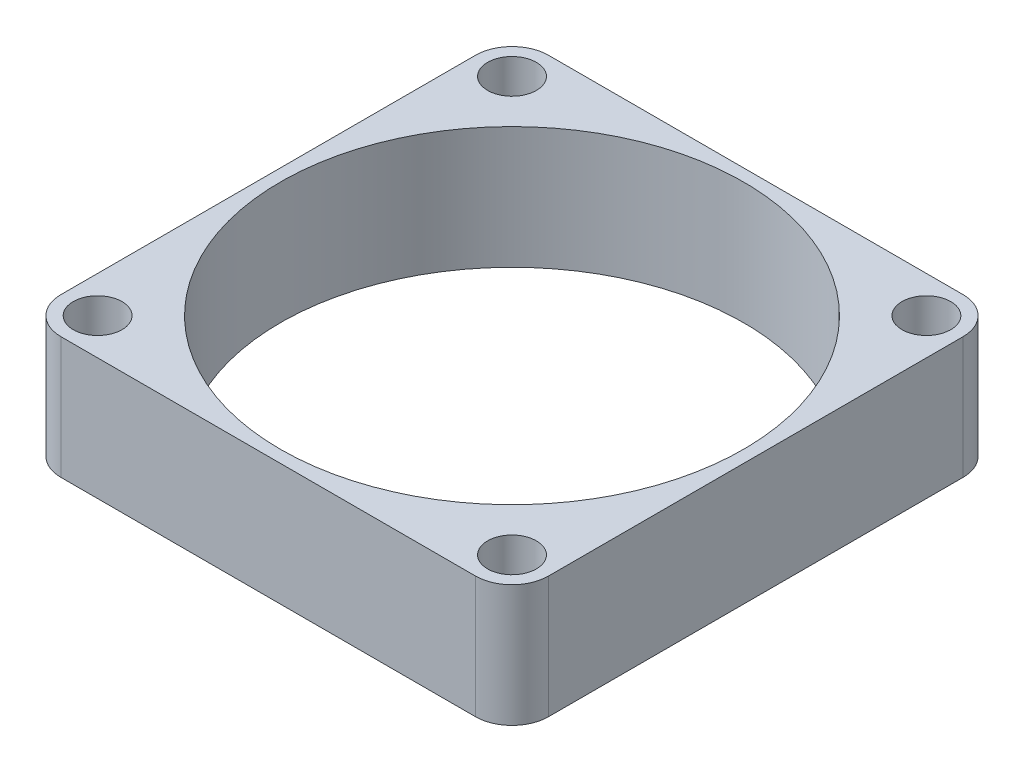
ISO-10303-21;
HEADER;
FILE_DESCRIPTION(('STEP AP214'),'2;1');
FILE_NAME('part.step','',(''),(''),'','','');
FILE_SCHEMA(('AUTOMOTIVE_DESIGN { 1 0 10303 214 1 1 1 1 }'));
ENDSEC;
DATA;
#1=APPLICATION_CONTEXT('core data for automotive mechanical design processes');
#2=APPLICATION_PROTOCOL_DEFINITION('international standard','automotive_design',2000,#1);
#3=PRODUCT_CONTEXT('',#1,'mechanical');
#4=PRODUCT('Part','Part','',(#3));
#5=PRODUCT_RELATED_PRODUCT_CATEGORY('part','',(#4));
#6=PRODUCT_DEFINITION_FORMATION('','',#4);
#7=PRODUCT_DEFINITION_CONTEXT('part definition',#1,'design');
#8=PRODUCT_DEFINITION('design','',#6,#7);
#9=PRODUCT_DEFINITION_SHAPE('','',#8);
#10=(LENGTH_UNIT() NAMED_UNIT(*) SI_UNIT(.MILLI.,.METRE.));
#11=(NAMED_UNIT(*) PLANE_ANGLE_UNIT() SI_UNIT($,.RADIAN.));
#12=(NAMED_UNIT(*) SI_UNIT($,.STERADIAN.) SOLID_ANGLE_UNIT());
#13=UNCERTAINTY_MEASURE_WITH_UNIT(LENGTH_MEASURE(1.E-05),#10,'distance_accuracy_value','');
#14=(GEOMETRIC_REPRESENTATION_CONTEXT(3) GLOBAL_UNCERTAINTY_ASSIGNED_CONTEXT((#13)) GLOBAL_UNIT_ASSIGNED_CONTEXT((#10,
#11,#12)) REPRESENTATION_CONTEXT('',''));
#15=CARTESIAN_POINT('',(0.,0.,0.));
#16=DIRECTION('',(0.,0.,1.));
#17=DIRECTION('',(1.,0.,0.));
#18=AXIS2_PLACEMENT_3D('',#15,#16,#17);
#19=CARTESIAN_POINT('',(37.,10.,-37.));
#20=DIRECTION('',(0.,-1.,0.));
#21=DIRECTION('',(0.,0.,-1.));
#22=AXIS2_PLACEMENT_3D('',#19,#20,#21);
#23=PLANE('',#22);
#24=CARTESIAN_POINT('',(37.,10.,-37.));
#25=DIRECTION('',(0.,1.,0.));
#26=DIRECTION('',(0.,0.,-1.));
#27=AXIS2_PLACEMENT_3D('',#24,#25,#26);
#28=CIRCLE('',#27,3.);
#29=CARTESIAN_POINT('',(40.,10.,-37.));
#30=VERTEX_POINT('',#29);
#31=CARTESIAN_POINT('',(37.,10.,-40.));
#32=VERTEX_POINT('',#31);
#33=EDGE_CURVE('E146',#30,#32,#28,.T.);
#34=ORIENTED_EDGE('',*,*,#33,.T.);
#35=DIRECTION('',(-1.,0.,0.));
#36=VECTOR('',#35,1.);
#37=CARTESIAN_POINT('',(3.00000000000002,10.,-40.));
#38=LINE('',#37,#36);
#39=CARTESIAN_POINT('',(3.00000000000002,10.,-40.));
#40=VERTEX_POINT('',#39);
#41=EDGE_CURVE('E94',#32,#40,#38,.T.);
#42=ORIENTED_EDGE('',*,*,#41,.T.);
#43=CARTESIAN_POINT('',(3.,10.,-37.));
#44=DIRECTION('',(0.,1.,0.));
#45=DIRECTION('',(0.,0.,-1.));
#46=AXIS2_PLACEMENT_3D('',#43,#44,#45);
#47=CIRCLE('',#46,3.);
#48=CARTESIAN_POINT('',(0.,10.,-37.));
#49=VERTEX_POINT('',#48);
#50=EDGE_CURVE('E161',#40,#49,#47,.T.);
#51=ORIENTED_EDGE('',*,*,#50,.T.);
#52=DIRECTION('',(0.,0.,1.));
#53=VECTOR('',#52,1.);
#54=CARTESIAN_POINT('',(0.,10.,-3.00000000000002));
#55=LINE('',#54,#53);
#56=CARTESIAN_POINT('',(0.,10.,-3.00000000000002));
#57=VERTEX_POINT('',#56);
#58=EDGE_CURVE('E174',#49,#57,#55,.T.);
#59=ORIENTED_EDGE('',*,*,#58,.T.);
#60=CARTESIAN_POINT('',(3.,10.,-3.));
#61=DIRECTION('',(0.,1.,0.));
#62=DIRECTION('',(0.,0.,1.));
#63=AXIS2_PLACEMENT_3D('',#60,#61,#62);
#64=CIRCLE('',#63,3.);
#65=CARTESIAN_POINT('',(3.,10.,0.));
#66=VERTEX_POINT('',#65);
#67=EDGE_CURVE('E113',#57,#66,#64,.T.);
#68=ORIENTED_EDGE('',*,*,#67,.T.);
#69=DIRECTION('',(1.,0.,0.));
#70=VECTOR('',#69,1.);
#71=CARTESIAN_POINT('',(3.00000000000002,10.,0.));
#72=LINE('',#71,#70);
#73=CARTESIAN_POINT('',(37.,10.,0.));
#74=VERTEX_POINT('',#73);
#75=EDGE_CURVE('E107',#66,#74,#72,.T.);
#76=ORIENTED_EDGE('',*,*,#75,.T.);
#77=CARTESIAN_POINT('',(37.,10.,-3.));
#78=DIRECTION('',(0.,1.,0.));
#79=DIRECTION('',(0.,0.,-1.));
#80=AXIS2_PLACEMENT_3D('',#77,#78,#79);
#81=CIRCLE('',#80,3.);
#82=CARTESIAN_POINT('',(40.,10.,-3.00000000000002));
#83=VERTEX_POINT('',#82);
#84=EDGE_CURVE('E111',#74,#83,#81,.T.);
#85=ORIENTED_EDGE('',*,*,#84,.T.);
#86=DIRECTION('',(0.,0.,-1.));
#87=VECTOR('',#86,1.);
#88=CARTESIAN_POINT('',(40.,10.,-3.00000000000002));
#89=LINE('',#88,#87);
#90=EDGE_CURVE('E51',#83,#30,#89,.T.);
#91=ORIENTED_EDGE('',*,*,#90,.T.);
#92=EDGE_LOOP('',(#34,#42,#51,#59,#68,#76,#85,#91));
#93=FACE_BOUND('',#92,.T.);
#94=CARTESIAN_POINT('',(20.,10.,-20.));
#95=DIRECTION('',(0.,1.,0.));
#96=DIRECTION('',(0.,0.,1.));
#97=AXIS2_PLACEMENT_3D('',#94,#95,#96);
#98=CIRCLE('',#97,19.);
#99=CARTESIAN_POINT('',(20.,10.,-0.999999999999997));
#100=VERTEX_POINT('',#99);
#101=EDGE_CURVE('E135',#100,#100,#98,.T.);
#102=ORIENTED_EDGE('',*,*,#101,.F.);
#103=EDGE_LOOP('',(#102));
#104=FACE_BOUND('',#103,.T.);
#105=CARTESIAN_POINT('',(3.,10.,-37.));
#106=DIRECTION('',(0.,1.,0.));
#107=DIRECTION('',(0.,0.,1.));
#108=AXIS2_PLACEMENT_3D('',#105,#106,#107);
#109=CIRCLE('',#108,2.);
#110=CARTESIAN_POINT('',(3.,10.,-35.));
#111=VERTEX_POINT('',#110);
#112=EDGE_CURVE('E183',#111,#111,#109,.T.);
#113=ORIENTED_EDGE('',*,*,#112,.F.);
#114=EDGE_LOOP('',(#113));
#115=FACE_BOUND('',#114,.T.);
#116=CARTESIAN_POINT('',(37.,10.,-37.));
#117=DIRECTION('',(0.,1.,0.));
#118=DIRECTION('',(0.,0.,-1.));
#119=AXIS2_PLACEMENT_3D('',#116,#117,#118);
#120=CIRCLE('',#119,2.);
#121=CARTESIAN_POINT('',(37.,10.,-39.));
#122=VERTEX_POINT('',#121);
#123=EDGE_CURVE('E189',#122,#122,#120,.T.);
#124=ORIENTED_EDGE('',*,*,#123,.F.);
#125=EDGE_LOOP('',(#124));
#126=FACE_BOUND('',#125,.T.);
#127=CARTESIAN_POINT('',(37.,10.,-3.));
#128=DIRECTION('',(0.,1.,0.));
#129=DIRECTION('',(0.,0.,1.));
#130=AXIS2_PLACEMENT_3D('',#127,#128,#129);
#131=CIRCLE('',#130,2.);
#132=CARTESIAN_POINT('',(37.,10.,-0.999999999999995));
#133=VERTEX_POINT('',#132);
#134=EDGE_CURVE('E195',#133,#133,#131,.T.);
#135=ORIENTED_EDGE('',*,*,#134,.F.);
#136=EDGE_LOOP('',(#135));
#137=FACE_BOUND('',#136,.T.);
#138=CARTESIAN_POINT('',(3.,10.,-3.));
#139=DIRECTION('',(0.,1.,0.));
#140=DIRECTION('',(0.,0.,-1.));
#141=AXIS2_PLACEMENT_3D('',#138,#139,#140);
#142=CIRCLE('',#141,2.);
#143=CARTESIAN_POINT('',(3.,10.,-5.));
#144=VERTEX_POINT('',#143);
#145=EDGE_CURVE('E201',#144,#144,#142,.T.);
#146=ORIENTED_EDGE('',*,*,#145,.F.);
#147=EDGE_LOOP('',(#146));
#148=FACE_BOUND('',#147,.T.);
#149=ADVANCED_FACE('F34',(#93,#104,#115,#126,#137,#148),#23,.F.);
#150=CARTESIAN_POINT('',(37.,0.,-37.));
#151=DIRECTION('',(0.,-1.,0.));
#152=DIRECTION('',(0.,0.,-1.));
#153=AXIS2_PLACEMENT_3D('',#150,#151,#152);
#154=PLANE('',#153);
#155=CARTESIAN_POINT('',(37.,0.,-3.));
#156=DIRECTION('',(0.,1.,0.));
#157=DIRECTION('',(0.,0.,1.));
#158=AXIS2_PLACEMENT_3D('',#155,#156,#157);
#159=CIRCLE('',#158,2.);
#160=CARTESIAN_POINT('',(37.,0.,-0.999999999999995));
#161=VERTEX_POINT('',#160);
#162=EDGE_CURVE('E198',#161,#161,#159,.T.);
#163=ORIENTED_EDGE('',*,*,#162,.T.);
#164=EDGE_LOOP('',(#163));
#165=FACE_BOUND('',#164,.T.);
#166=CARTESIAN_POINT('',(3.,0.,-37.));
#167=DIRECTION('',(0.,1.,0.));
#168=DIRECTION('',(0.,0.,1.));
#169=AXIS2_PLACEMENT_3D('',#166,#167,#168);
#170=CIRCLE('',#169,2.);
#171=CARTESIAN_POINT('',(3.,0.,-35.));
#172=VERTEX_POINT('',#171);
#173=EDGE_CURVE('E186',#172,#172,#170,.T.);
#174=ORIENTED_EDGE('',*,*,#173,.T.);
#175=EDGE_LOOP('',(#174));
#176=FACE_BOUND('',#175,.T.);
#177=CARTESIAN_POINT('',(37.,0.,-37.));
#178=DIRECTION('',(0.,1.,0.));
#179=DIRECTION('',(0.,0.,-1.));
#180=AXIS2_PLACEMENT_3D('',#177,#178,#179);
#181=CIRCLE('',#180,3.);
#182=CARTESIAN_POINT('',(40.,0.,-37.));
#183=VERTEX_POINT('',#182);
#184=CARTESIAN_POINT('',(37.,0.,-40.));
#185=VERTEX_POINT('',#184);
#186=EDGE_CURVE('E131',#183,#185,#181,.T.);
#187=ORIENTED_EDGE('',*,*,#186,.F.);
#188=DIRECTION('',(0.,0.,-1.));
#189=VECTOR('',#188,1.);
#190=CARTESIAN_POINT('',(40.,0.,-3.00000000000002));
#191=LINE('',#190,#189);
#192=CARTESIAN_POINT('',(40.,0.,-3.00000000000002));
#193=VERTEX_POINT('',#192);
#194=EDGE_CURVE('E86',#193,#183,#191,.T.);
#195=ORIENTED_EDGE('',*,*,#194,.F.);
#196=CARTESIAN_POINT('',(37.,0.,-3.));
#197=DIRECTION('',(0.,1.,0.));
#198=DIRECTION('',(0.,0.,-1.));
#199=AXIS2_PLACEMENT_3D('',#196,#197,#198);
#200=CIRCLE('',#199,3.);
#201=CARTESIAN_POINT('',(37.,0.,0.));
#202=VERTEX_POINT('',#201);
#203=EDGE_CURVE('E80',#202,#193,#200,.T.);
#204=ORIENTED_EDGE('',*,*,#203,.F.);
#205=DIRECTION('',(1.,0.,0.));
#206=VECTOR('',#205,1.);
#207=CARTESIAN_POINT('',(3.00000000000002,0.,0.));
#208=LINE('',#207,#206);
#209=CARTESIAN_POINT('',(3.,0.,0.));
#210=VERTEX_POINT('',#209);
#211=EDGE_CURVE('E121',#210,#202,#208,.T.);
#212=ORIENTED_EDGE('',*,*,#211,.F.);
#213=CARTESIAN_POINT('',(3.,0.,-3.));
#214=DIRECTION('',(0.,1.,0.));
#215=DIRECTION('',(0.,0.,1.));
#216=AXIS2_PLACEMENT_3D('',#213,#214,#215);
#217=CIRCLE('',#216,3.);
#218=CARTESIAN_POINT('',(0.,0.,-3.00000000000002));
#219=VERTEX_POINT('',#218);
#220=EDGE_CURVE('E141',#219,#210,#217,.T.);
#221=ORIENTED_EDGE('',*,*,#220,.F.);
#222=DIRECTION('',(0.,0.,1.));
#223=VECTOR('',#222,1.);
#224=CARTESIAN_POINT('',(0.,0.,-3.00000000000002));
#225=LINE('',#224,#223);
#226=CARTESIAN_POINT('',(0.,0.,-37.));
#227=VERTEX_POINT('',#226);
#228=EDGE_CURVE('E139',#227,#219,#225,.T.);
#229=ORIENTED_EDGE('',*,*,#228,.F.);
#230=CARTESIAN_POINT('',(3.,0.,-37.));
#231=DIRECTION('',(0.,1.,0.));
#232=DIRECTION('',(0.,0.,-1.));
#233=AXIS2_PLACEMENT_3D('',#230,#231,#232);
#234=CIRCLE('',#233,3.);
#235=CARTESIAN_POINT('',(3.00000000000002,0.,-40.));
#236=VERTEX_POINT('',#235);
#237=EDGE_CURVE('E137',#236,#227,#234,.T.);
#238=ORIENTED_EDGE('',*,*,#237,.F.);
#239=DIRECTION('',(-1.,0.,0.));
#240=VECTOR('',#239,1.);
#241=CARTESIAN_POINT('',(3.00000000000002,0.,-40.));
#242=LINE('',#241,#240);
#243=EDGE_CURVE('E134',#185,#236,#242,.T.);
#244=ORIENTED_EDGE('',*,*,#243,.F.);
#245=EDGE_LOOP('',(#187,#195,#204,#212,#221,#229,#238,#244));
#246=FACE_BOUND('',#245,.T.);
#247=CARTESIAN_POINT('',(20.,0.,-20.));
#248=DIRECTION('',(0.,1.,0.));
#249=DIRECTION('',(0.,0.,1.));
#250=AXIS2_PLACEMENT_3D('',#247,#248,#249);
#251=CIRCLE('',#250,19.);
#252=CARTESIAN_POINT('',(20.,0.,-0.999999999999997));
#253=VERTEX_POINT('',#252);
#254=EDGE_CURVE('E180',#253,#253,#251,.T.);
#255=ORIENTED_EDGE('',*,*,#254,.T.);
#256=EDGE_LOOP('',(#255));
#257=FACE_BOUND('',#256,.T.);
#258=CARTESIAN_POINT('',(37.,0.,-37.));
#259=DIRECTION('',(0.,1.,0.));
#260=DIRECTION('',(0.,0.,-1.));
#261=AXIS2_PLACEMENT_3D('',#258,#259,#260);
#262=CIRCLE('',#261,2.);
#263=CARTESIAN_POINT('',(37.,0.,-39.));
#264=VERTEX_POINT('',#263);
#265=EDGE_CURVE('E192',#264,#264,#262,.T.);
#266=ORIENTED_EDGE('',*,*,#265,.T.);
#267=EDGE_LOOP('',(#266));
#268=FACE_BOUND('',#267,.T.);
#269=CARTESIAN_POINT('',(3.,0.,-3.));
#270=DIRECTION('',(0.,1.,0.));
#271=DIRECTION('',(0.,0.,-1.));
#272=AXIS2_PLACEMENT_3D('',#269,#270,#271);
#273=CIRCLE('',#272,2.);
#274=CARTESIAN_POINT('',(3.,0.,-5.));
#275=VERTEX_POINT('',#274);
#276=EDGE_CURVE('E204',#275,#275,#273,.T.);
#277=ORIENTED_EDGE('',*,*,#276,.T.);
#278=EDGE_LOOP('',(#277));
#279=FACE_BOUND('',#278,.T.);
#280=ADVANCED_FACE('F165',(#165,#176,#246,#257,#268,#279),#154,.T.);
#281=CARTESIAN_POINT('',(37.,10.,-37.));
#282=DIRECTION('',(0.,-1.,0.));
#283=DIRECTION('',(0.,0.,-1.));
#284=AXIS2_PLACEMENT_3D('',#281,#282,#283);
#285=CYLINDRICAL_SURFACE('',#284,3.);
#286=ORIENTED_EDGE('',*,*,#186,.T.);
#287=DIRECTION('',(0.,-1.,0.));
#288=VECTOR('',#287,1.);
#289=CARTESIAN_POINT('',(37.,10.,-40.));
#290=LINE('',#289,#288);
#291=EDGE_CURVE('E11',#32,#185,#290,.T.);
#292=ORIENTED_EDGE('',*,*,#291,.F.);
#293=ORIENTED_EDGE('',*,*,#33,.F.);
#294=DIRECTION('',(0.,-1.,0.));
#295=VECTOR('',#294,1.);
#296=CARTESIAN_POINT('',(40.,10.,-37.));
#297=LINE('',#296,#295);
#298=EDGE_CURVE('E127',#30,#183,#297,.T.);
#299=ORIENTED_EDGE('',*,*,#298,.T.);
#300=EDGE_LOOP('',(#286,#292,#293,#299));
#301=FACE_BOUND('',#300,.T.);
#302=ADVANCED_FACE('F36',(#301),#285,.T.);
#303=CARTESIAN_POINT('',(3.00000000000002,10.,-40.));
#304=DIRECTION('',(0.,0.,1.));
#305=DIRECTION('',(1.,0.,0.));
#306=AXIS2_PLACEMENT_3D('',#303,#304,#305);
#307=PLANE('',#306);
#308=ORIENTED_EDGE('',*,*,#243,.T.);
#309=DIRECTION('',(0.,-1.,0.));
#310=VECTOR('',#309,1.);
#311=CARTESIAN_POINT('',(3.00000000000002,10.,-40.));
#312=LINE('',#311,#310);
#313=EDGE_CURVE('E43',#40,#236,#312,.T.);
#314=ORIENTED_EDGE('',*,*,#313,.F.);
#315=ORIENTED_EDGE('',*,*,#41,.F.);
#316=ORIENTED_EDGE('',*,*,#291,.T.);
#317=EDGE_LOOP('',(#308,#314,#315,#316));
#318=FACE_BOUND('',#317,.T.);
#319=ADVANCED_FACE('F236',(#318),#307,.F.);
#320=CARTESIAN_POINT('',(3.,10.,-37.));
#321=DIRECTION('',(0.,-1.,0.));
#322=DIRECTION('',(0.,0.,-1.));
#323=AXIS2_PLACEMENT_3D('',#320,#321,#322);
#324=CYLINDRICAL_SURFACE('',#323,3.);
#325=ORIENTED_EDGE('',*,*,#237,.T.);
#326=DIRECTION('',(0.,-1.,0.));
#327=VECTOR('',#326,1.);
#328=CARTESIAN_POINT('',(0.,10.,-37.));
#329=LINE('',#328,#327);
#330=EDGE_CURVE('E153',#49,#227,#329,.T.);
#331=ORIENTED_EDGE('',*,*,#330,.F.);
#332=ORIENTED_EDGE('',*,*,#50,.F.);
#333=ORIENTED_EDGE('',*,*,#313,.T.);
#334=EDGE_LOOP('',(#325,#331,#332,#333));
#335=FACE_BOUND('',#334,.T.);
#336=ADVANCED_FACE('F159',(#335),#324,.T.);
#337=CARTESIAN_POINT('',(0.,10.,-3.00000000000002));
#338=DIRECTION('',(1.,0.,0.));
#339=DIRECTION('',(0.,0.,-1.));
#340=AXIS2_PLACEMENT_3D('',#337,#338,#339);
#341=PLANE('',#340);
#342=ORIENTED_EDGE('',*,*,#228,.T.);
#343=DIRECTION('',(0.,-1.,0.));
#344=VECTOR('',#343,1.);
#345=CARTESIAN_POINT('',(0.,10.,-3.00000000000002));
#346=LINE('',#345,#344);
#347=EDGE_CURVE('E150',#57,#219,#346,.T.);
#348=ORIENTED_EDGE('',*,*,#347,.F.);
#349=ORIENTED_EDGE('',*,*,#58,.F.);
#350=ORIENTED_EDGE('',*,*,#330,.T.);
#351=EDGE_LOOP('',(#342,#348,#349,#350));
#352=FACE_BOUND('',#351,.T.);
#353=ADVANCED_FACE('F170',(#352),#341,.F.);
#354=CARTESIAN_POINT('',(3.,10.,-3.));
#355=DIRECTION('',(0.,-1.,0.));
#356=DIRECTION('',(0.,0.,-1.));
#357=AXIS2_PLACEMENT_3D('',#354,#355,#356);
#358=CYLINDRICAL_SURFACE('',#357,3.);
#359=ORIENTED_EDGE('',*,*,#220,.T.);
#360=DIRECTION('',(0.,-1.,0.));
#361=VECTOR('',#360,1.);
#362=CARTESIAN_POINT('',(3.,10.,0.));
#363=LINE('',#362,#361);
#364=EDGE_CURVE('E122',#66,#210,#363,.T.);
#365=ORIENTED_EDGE('',*,*,#364,.F.);
#366=ORIENTED_EDGE('',*,*,#67,.F.);
#367=ORIENTED_EDGE('',*,*,#347,.T.);
#368=EDGE_LOOP('',(#359,#365,#366,#367));
#369=FACE_BOUND('',#368,.T.);
#370=ADVANCED_FACE('F173',(#369),#358,.T.);
#371=CARTESIAN_POINT('',(3.00000000000002,10.,0.));
#372=DIRECTION('',(0.,0.,-1.));
#373=DIRECTION('',(-1.,0.,0.));
#374=AXIS2_PLACEMENT_3D('',#371,#372,#373);
#375=PLANE('',#374);
#376=ORIENTED_EDGE('',*,*,#211,.T.);
#377=DIRECTION('',(0.,-1.,0.));
#378=VECTOR('',#377,1.);
#379=CARTESIAN_POINT('',(37.,10.,0.));
#380=LINE('',#379,#378);
#381=EDGE_CURVE('E118',#74,#202,#380,.T.);
#382=ORIENTED_EDGE('',*,*,#381,.F.);
#383=ORIENTED_EDGE('',*,*,#75,.F.);
#384=ORIENTED_EDGE('',*,*,#364,.T.);
#385=EDGE_LOOP('',(#376,#382,#383,#384));
#386=FACE_BOUND('',#385,.T.);
#387=ADVANCED_FACE('F119',(#386),#375,.F.);
#388=CARTESIAN_POINT('',(37.,10.,-3.));
#389=DIRECTION('',(0.,-1.,0.));
#390=DIRECTION('',(0.,0.,-1.));
#391=AXIS2_PLACEMENT_3D('',#388,#389,#390);
#392=CYLINDRICAL_SURFACE('',#391,3.);
#393=ORIENTED_EDGE('',*,*,#203,.T.);
#394=DIRECTION('',(0.,-1.,0.));
#395=VECTOR('',#394,1.);
#396=CARTESIAN_POINT('',(40.,10.,-3.00000000000002));
#397=LINE('',#396,#395);
#398=EDGE_CURVE('E123',#83,#193,#397,.T.);
#399=ORIENTED_EDGE('',*,*,#398,.F.);
#400=ORIENTED_EDGE('',*,*,#84,.F.);
#401=ORIENTED_EDGE('',*,*,#381,.T.);
#402=EDGE_LOOP('',(#393,#399,#400,#401));
#403=FACE_BOUND('',#402,.T.);
#404=ADVANCED_FACE('F125',(#403),#392,.T.);
#405=CARTESIAN_POINT('',(40.,10.,-3.00000000000002));
#406=DIRECTION('',(-1.,0.,0.));
#407=DIRECTION('',(0.,0.,1.));
#408=AXIS2_PLACEMENT_3D('',#405,#406,#407);
#409=PLANE('',#408);
#410=ORIENTED_EDGE('',*,*,#194,.T.);
#411=ORIENTED_EDGE('',*,*,#298,.F.);
#412=ORIENTED_EDGE('',*,*,#90,.F.);
#413=ORIENTED_EDGE('',*,*,#398,.T.);
#414=EDGE_LOOP('',(#410,#411,#412,#413));
#415=FACE_BOUND('',#414,.T.);
#416=ADVANCED_FACE('F224',(#415),#409,.F.);
#417=CARTESIAN_POINT('',(20.,10.,-20.));
#418=DIRECTION('',(0.,-1.,0.));
#419=DIRECTION('',(0.,0.,-1.));
#420=AXIS2_PLACEMENT_3D('',#417,#418,#419);
#421=CYLINDRICAL_SURFACE('',#420,19.);
#422=ORIENTED_EDGE('',*,*,#101,.T.);
#423=EDGE_LOOP('',(#422));
#424=FACE_BOUND('',#423,.T.);
#425=ORIENTED_EDGE('',*,*,#254,.F.);
#426=EDGE_LOOP('',(#425));
#427=FACE_BOUND('',#426,.T.);
#428=ADVANCED_FACE('F221',(#424,#427),#421,.F.);
#429=CARTESIAN_POINT('',(3.,10.,-37.));
#430=DIRECTION('',(0.,-1.,0.));
#431=DIRECTION('',(0.,0.,-1.));
#432=AXIS2_PLACEMENT_3D('',#429,#430,#431);
#433=CYLINDRICAL_SURFACE('',#432,2.);
#434=ORIENTED_EDGE('',*,*,#112,.T.);
#435=EDGE_LOOP('',(#434));
#436=FACE_BOUND('',#435,.T.);
#437=ORIENTED_EDGE('',*,*,#173,.F.);
#438=EDGE_LOOP('',(#437));
#439=FACE_BOUND('',#438,.T.);
#440=ADVANCED_FACE('F300',(#436,#439),#433,.F.);
#441=CARTESIAN_POINT('',(37.,10.,-37.));
#442=DIRECTION('',(0.,-1.,0.));
#443=DIRECTION('',(0.,0.,-1.));
#444=AXIS2_PLACEMENT_3D('',#441,#442,#443);
#445=CYLINDRICAL_SURFACE('',#444,2.);
#446=ORIENTED_EDGE('',*,*,#123,.T.);
#447=EDGE_LOOP('',(#446));
#448=FACE_BOUND('',#447,.T.);
#449=ORIENTED_EDGE('',*,*,#265,.F.);
#450=EDGE_LOOP('',(#449));
#451=FACE_BOUND('',#450,.T.);
#452=ADVANCED_FACE('F308',(#448,#451),#445,.F.);
#453=CARTESIAN_POINT('',(37.,10.,-3.));
#454=DIRECTION('',(0.,-1.,0.));
#455=DIRECTION('',(0.,0.,-1.));
#456=AXIS2_PLACEMENT_3D('',#453,#454,#455);
#457=CYLINDRICAL_SURFACE('',#456,2.);
#458=ORIENTED_EDGE('',*,*,#134,.T.);
#459=EDGE_LOOP('',(#458));
#460=FACE_BOUND('',#459,.T.);
#461=ORIENTED_EDGE('',*,*,#162,.F.);
#462=EDGE_LOOP('',(#461));
#463=FACE_BOUND('',#462,.T.);
#464=ADVANCED_FACE('F316',(#460,#463),#457,.F.);
#465=CARTESIAN_POINT('',(3.,10.,-3.));
#466=DIRECTION('',(0.,-1.,0.));
#467=DIRECTION('',(0.,0.,-1.));
#468=AXIS2_PLACEMENT_3D('',#465,#466,#467);
#469=CYLINDRICAL_SURFACE('',#468,2.);
#470=ORIENTED_EDGE('',*,*,#145,.T.);
#471=EDGE_LOOP('',(#470));
#472=FACE_BOUND('',#471,.T.);
#473=ORIENTED_EDGE('',*,*,#276,.F.);
#474=EDGE_LOOP('',(#473));
#475=FACE_BOUND('',#474,.T.);
#476=ADVANCED_FACE('F210',(#472,#475),#469,.F.);
#477=CLOSED_SHELL('',(#149,#280,#302,#319,#336,#353,#370,#387,#404,#416,#428,#440,#452,#464,#476));
#478=MANIFOLD_SOLID_BREP('B2',#477);
#479=ADVANCED_BREP_SHAPE_REPRESENTATION('',(#18,#478),#14);
#480=SHAPE_DEFINITION_REPRESENTATION(#9,#479);
ENDSEC;
END-ISO-10303-21;
